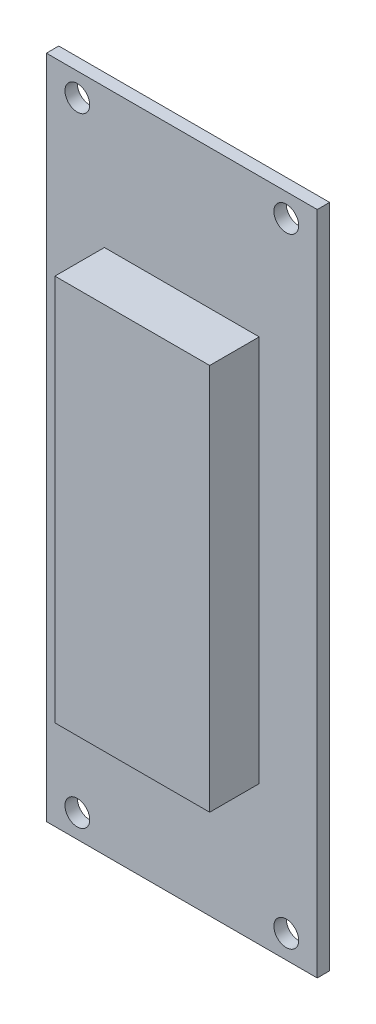
ISO-10303-21;
HEADER;
FILE_DESCRIPTION(('STEP AP214'),'2;1');
FILE_NAME('part.step','',(''),(''),'','','');
FILE_SCHEMA(('AUTOMOTIVE_DESIGN { 1 0 10303 214 1 1 1 1 }'));
ENDSEC;
DATA;
#1=APPLICATION_CONTEXT('core data for automotive mechanical design processes');
#2=APPLICATION_PROTOCOL_DEFINITION('international standard','automotive_design',2000,#1);
#3=PRODUCT_CONTEXT('',#1,'mechanical');
#4=PRODUCT('Part','Part','',(#3));
#5=PRODUCT_RELATED_PRODUCT_CATEGORY('part','',(#4));
#6=PRODUCT_DEFINITION_FORMATION('','',#4);
#7=PRODUCT_DEFINITION_CONTEXT('part definition',#1,'design');
#8=PRODUCT_DEFINITION('design','',#6,#7);
#9=PRODUCT_DEFINITION_SHAPE('','',#8);
#10=(LENGTH_UNIT() NAMED_UNIT(*) SI_UNIT(.MILLI.,.METRE.));
#11=(NAMED_UNIT(*) PLANE_ANGLE_UNIT() SI_UNIT($,.RADIAN.));
#12=(NAMED_UNIT(*) SI_UNIT($,.STERADIAN.) SOLID_ANGLE_UNIT());
#13=UNCERTAINTY_MEASURE_WITH_UNIT(LENGTH_MEASURE(1.E-05),#10,'distance_accuracy_value','');
#14=(GEOMETRIC_REPRESENTATION_CONTEXT(3) GLOBAL_UNCERTAINTY_ASSIGNED_CONTEXT((#13)) GLOBAL_UNIT_ASSIGNED_CONTEXT((#10,
#11,#12)) REPRESENTATION_CONTEXT('',''));
#15=CARTESIAN_POINT('',(0.,0.,0.));
#16=DIRECTION('',(0.,0.,1.));
#17=DIRECTION('',(1.,0.,0.));
#18=AXIS2_PLACEMENT_3D('',#15,#16,#17);
#19=CARTESIAN_POINT('',(-203.,-47.,550.));
#20=DIRECTION('',(0.,0.,1.));
#21=DIRECTION('',(1.,0.,0.));
#22=AXIS2_PLACEMENT_3D('',#19,#20,#21);
#23=PLANE('',#22);
#24=DIRECTION('',(0.,1.,0.));
#25=VECTOR('',#24,1.);
#26=CARTESIAN_POINT('',(-203.,-47.,550.));
#27=LINE('',#26,#25);
#28=CARTESIAN_POINT('',(-203.,-47.,550.));
#29=VERTEX_POINT('',#28);
#30=CARTESIAN_POINT('',(-203.,3.,550.));
#31=VERTEX_POINT('',#30);
#32=EDGE_CURVE('E165',#29,#31,#27,.T.);
#33=ORIENTED_EDGE('',*,*,#32,.F.);
#34=DIRECTION('',(1.,0.,0.));
#35=VECTOR('',#34,1.);
#36=CARTESIAN_POINT('',(-203.,-47.,550.));
#37=LINE('',#36,#35);
#38=CARTESIAN_POINT('',(-183.,-47.,550.));
#39=VERTEX_POINT('',#38);
#40=EDGE_CURVE('E218',#29,#39,#37,.T.);
#41=ORIENTED_EDGE('',*,*,#40,.T.);
#42=DIRECTION('',(0.,1.,0.));
#43=VECTOR('',#42,1.);
#44=CARTESIAN_POINT('',(-183.,-47.,550.));
#45=LINE('',#44,#43);
#46=CARTESIAN_POINT('',(-183.,3.,550.));
#47=VERTEX_POINT('',#46);
#48=EDGE_CURVE('E39',#39,#47,#45,.T.);
#49=ORIENTED_EDGE('',*,*,#48,.T.);
#50=DIRECTION('',(1.,0.,0.));
#51=VECTOR('',#50,1.);
#52=CARTESIAN_POINT('',(-203.,3.,550.));
#53=LINE('',#52,#51);
#54=EDGE_CURVE('E184',#31,#47,#53,.T.);
#55=ORIENTED_EDGE('',*,*,#54,.F.);
#56=EDGE_LOOP('',(#33,#41,#49,#55));
#57=FACE_BOUND('',#56,.T.);
#58=ADVANCED_FACE('F14',(#57),#23,.T.);
#59=CARTESIAN_POINT('',(-179.5,18.,537.));
#60=DIRECTION('',(0.,0.,1.));
#61=DIRECTION('',(1.,0.,0.));
#62=AXIS2_PLACEMENT_3D('',#59,#60,#61);
#63=CYLINDRICAL_SURFACE('',#62,1.6);
#64=DIRECTION('',(0.,0.,1.));
#65=VECTOR('',#64,1.);
#66=CARTESIAN_POINT('',(-177.9,18.,537.));
#67=LINE('',#66,#65);
#68=CARTESIAN_POINT('',(-177.9,18.,542.));
#69=VERTEX_POINT('',#68);
#70=CARTESIAN_POINT('',(-177.9,18.,543.6));
#71=VERTEX_POINT('',#70);
#72=EDGE_CURVE('E9',#69,#71,#67,.T.);
#73=ORIENTED_EDGE('',*,*,#72,.F.);
#74=CARTESIAN_POINT('',(-179.5,18.,542.));
#75=DIRECTION('',(0.,0.,1.));
#76=DIRECTION('',(1.,0.,0.));
#77=AXIS2_PLACEMENT_3D('',#74,#75,#76);
#78=CIRCLE('',#77,1.6);
#79=EDGE_CURVE('E158',#69,#69,#78,.T.);
#80=ORIENTED_EDGE('',*,*,#79,.F.);
#81=ORIENTED_EDGE('',*,*,#72,.T.);
#82=CARTESIAN_POINT('',(-179.5,18.,543.6));
#83=DIRECTION('',(0.,0.,1.));
#84=DIRECTION('',(1.,0.,0.));
#85=AXIS2_PLACEMENT_3D('',#82,#83,#84);
#86=CIRCLE('',#85,1.6);
#87=EDGE_CURVE('E190',#71,#71,#86,.T.);
#88=ORIENTED_EDGE('',*,*,#87,.T.);
#89=EDGE_LOOP('',(#73,#80,#81,#88));
#90=FACE_BOUND('',#89,.T.);
#91=ADVANCED_FACE('F312',(#90),#63,.F.);
#92=CARTESIAN_POINT('',(-206.5,18.,537.));
#93=DIRECTION('',(0.,0.,1.));
#94=DIRECTION('',(1.,0.,0.));
#95=AXIS2_PLACEMENT_3D('',#92,#93,#94);
#96=CYLINDRICAL_SURFACE('',#95,1.6);
#97=DIRECTION('',(0.,0.,1.));
#98=VECTOR('',#97,1.);
#99=CARTESIAN_POINT('',(-204.9,18.,537.));
#100=LINE('',#99,#98);
#101=CARTESIAN_POINT('',(-204.9,18.,542.));
#102=VERTEX_POINT('',#101);
#103=CARTESIAN_POINT('',(-204.9,18.,543.6));
#104=VERTEX_POINT('',#103);
#105=EDGE_CURVE('E25',#102,#104,#100,.T.);
#106=ORIENTED_EDGE('',*,*,#105,.F.);
#107=CARTESIAN_POINT('',(-206.5,18.,542.));
#108=DIRECTION('',(0.,0.,1.));
#109=DIRECTION('',(1.,0.,0.));
#110=AXIS2_PLACEMENT_3D('',#107,#108,#109);
#111=CIRCLE('',#110,1.6);
#112=EDGE_CURVE('E168',#102,#102,#111,.T.);
#113=ORIENTED_EDGE('',*,*,#112,.F.);
#114=ORIENTED_EDGE('',*,*,#105,.T.);
#115=CARTESIAN_POINT('',(-206.5,18.,543.6));
#116=DIRECTION('',(0.,0.,1.));
#117=DIRECTION('',(1.,0.,0.));
#118=AXIS2_PLACEMENT_3D('',#115,#116,#117);
#119=CIRCLE('',#118,1.6);
#120=EDGE_CURVE('E193',#104,#104,#119,.T.);
#121=ORIENTED_EDGE('',*,*,#120,.T.);
#122=EDGE_LOOP('',(#106,#113,#114,#121));
#123=FACE_BOUND('',#122,.T.);
#124=ADVANCED_FACE('F264',(#123),#96,.F.);
#125=CARTESIAN_POINT('',(-183.,-47.,543.6));
#126=DIRECTION('',(1.,0.,0.));
#127=DIRECTION('',(0.,1.,0.));
#128=AXIS2_PLACEMENT_3D('',#125,#126,#127);
#129=PLANE('',#128);
#130=DIRECTION('',(0.,0.,1.));
#131=VECTOR('',#130,1.);
#132=CARTESIAN_POINT('',(-183.,-47.,543.6));
#133=LINE('',#132,#131);
#134=CARTESIAN_POINT('',(-183.,-47.,543.6));
#135=VERTEX_POINT('',#134);
#136=EDGE_CURVE('E183',#135,#39,#133,.T.);
#137=ORIENTED_EDGE('',*,*,#136,.F.);
#138=DIRECTION('',(0.,1.,0.));
#139=VECTOR('',#138,1.);
#140=CARTESIAN_POINT('',(-183.,-47.,543.6));
#141=LINE('',#140,#139);
#142=CARTESIAN_POINT('',(-183.,3.,543.6));
#143=VERTEX_POINT('',#142);
#144=EDGE_CURVE('E240',#135,#143,#141,.T.);
#145=ORIENTED_EDGE('',*,*,#144,.T.);
#146=DIRECTION('',(0.,0.,1.));
#147=VECTOR('',#146,1.);
#148=CARTESIAN_POINT('',(-183.,3.,543.6));
#149=LINE('',#148,#147);
#150=EDGE_CURVE('E180',#143,#47,#149,.T.);
#151=ORIENTED_EDGE('',*,*,#150,.T.);
#152=ORIENTED_EDGE('',*,*,#48,.F.);
#153=EDGE_LOOP('',(#137,#145,#151,#152));
#154=FACE_BOUND('',#153,.T.);
#155=ADVANCED_FACE('F331',(#154),#129,.T.);
#156=CARTESIAN_POINT('',(-203.,-47.,543.6));
#157=DIRECTION('',(0.,1.,0.));
#158=DIRECTION('',(1.,0.,0.));
#159=AXIS2_PLACEMENT_3D('',#156,#157,#158);
#160=PLANE('',#159);
#161=ORIENTED_EDGE('',*,*,#136,.T.);
#162=ORIENTED_EDGE('',*,*,#40,.F.);
#163=DIRECTION('',(0.,0.,1.));
#164=VECTOR('',#163,1.);
#165=CARTESIAN_POINT('',(-203.,-47.,543.6));
#166=LINE('',#165,#164);
#167=CARTESIAN_POINT('',(-203.,-47.,543.6));
#168=VERTEX_POINT('',#167);
#169=EDGE_CURVE('E229',#168,#29,#166,.T.);
#170=ORIENTED_EDGE('',*,*,#169,.F.);
#171=DIRECTION('',(1.,0.,0.));
#172=VECTOR('',#171,1.);
#173=CARTESIAN_POINT('',(-203.,-47.,543.6));
#174=LINE('',#173,#172);
#175=EDGE_CURVE('E228',#168,#135,#174,.T.);
#176=ORIENTED_EDGE('',*,*,#175,.T.);
#177=EDGE_LOOP('',(#161,#162,#170,#176));
#178=FACE_BOUND('',#177,.T.);
#179=ADVANCED_FACE('F334',(#178),#160,.F.);
#180=CARTESIAN_POINT('',(-203.,3.,543.6));
#181=DIRECTION('',(0.,1.,0.));
#182=DIRECTION('',(1.,0.,0.));
#183=AXIS2_PLACEMENT_3D('',#180,#181,#182);
#184=PLANE('',#183);
#185=DIRECTION('',(1.,0.,0.));
#186=VECTOR('',#185,1.);
#187=CARTESIAN_POINT('',(-203.,3.,543.6));
#188=LINE('',#187,#186);
#189=CARTESIAN_POINT('',(-203.,3.,543.6));
#190=VERTEX_POINT('',#189);
#191=EDGE_CURVE('E244',#190,#143,#188,.T.);
#192=ORIENTED_EDGE('',*,*,#191,.F.);
#193=DIRECTION('',(0.,0.,1.));
#194=VECTOR('',#193,1.);
#195=CARTESIAN_POINT('',(-203.,3.,543.6));
#196=LINE('',#195,#194);
#197=EDGE_CURVE('E18',#190,#31,#196,.T.);
#198=ORIENTED_EDGE('',*,*,#197,.T.);
#199=ORIENTED_EDGE('',*,*,#54,.T.);
#200=ORIENTED_EDGE('',*,*,#150,.F.);
#201=EDGE_LOOP('',(#192,#198,#199,#200));
#202=FACE_BOUND('',#201,.T.);
#203=ADVANCED_FACE('F322',(#202),#184,.T.);
#204=CARTESIAN_POINT('',(-203.,-47.,543.6));
#205=DIRECTION('',(1.,0.,0.));
#206=DIRECTION('',(0.,1.,0.));
#207=AXIS2_PLACEMENT_3D('',#204,#205,#206);
#208=PLANE('',#207);
#209=ORIENTED_EDGE('',*,*,#32,.T.);
#210=ORIENTED_EDGE('',*,*,#197,.F.);
#211=DIRECTION('',(0.,1.,0.));
#212=VECTOR('',#211,1.);
#213=CARTESIAN_POINT('',(-203.,-47.,543.6));
#214=LINE('',#213,#212);
#215=EDGE_CURVE('E206',#168,#190,#214,.T.);
#216=ORIENTED_EDGE('',*,*,#215,.F.);
#217=ORIENTED_EDGE('',*,*,#169,.T.);
#218=EDGE_LOOP('',(#209,#210,#216,#217));
#219=FACE_BOUND('',#218,.T.);
#220=ADVANCED_FACE('F325',(#219),#208,.F.);
#221=CARTESIAN_POINT('',(-179.5,-62.,537.));
#222=DIRECTION('',(0.,0.,1.));
#223=DIRECTION('',(1.,0.,0.));
#224=AXIS2_PLACEMENT_3D('',#221,#222,#223);
#225=CYLINDRICAL_SURFACE('',#224,1.6);
#226=DIRECTION('',(0.,0.,1.));
#227=VECTOR('',#226,1.);
#228=CARTESIAN_POINT('',(-177.9,-62.,537.));
#229=LINE('',#228,#227);
#230=CARTESIAN_POINT('',(-177.9,-62.,542.));
#231=VERTEX_POINT('',#230);
#232=CARTESIAN_POINT('',(-177.9,-62.,543.6));
#233=VERTEX_POINT('',#232);
#234=EDGE_CURVE('E157',#231,#233,#229,.T.);
#235=ORIENTED_EDGE('',*,*,#234,.F.);
#236=CARTESIAN_POINT('',(-179.5,-62.,542.));
#237=DIRECTION('',(0.,0.,1.));
#238=DIRECTION('',(1.,0.,0.));
#239=AXIS2_PLACEMENT_3D('',#236,#237,#238);
#240=CIRCLE('',#239,1.6);
#241=EDGE_CURVE('E221',#231,#231,#240,.T.);
#242=ORIENTED_EDGE('',*,*,#241,.F.);
#243=ORIENTED_EDGE('',*,*,#234,.T.);
#244=CARTESIAN_POINT('',(-179.5,-62.,543.6));
#245=DIRECTION('',(0.,0.,1.));
#246=DIRECTION('',(1.,0.,0.));
#247=AXIS2_PLACEMENT_3D('',#244,#245,#246);
#248=CIRCLE('',#247,1.6);
#249=EDGE_CURVE('E200',#233,#233,#248,.T.);
#250=ORIENTED_EDGE('',*,*,#249,.T.);
#251=EDGE_LOOP('',(#235,#242,#243,#250));
#252=FACE_BOUND('',#251,.T.);
#253=ADVANCED_FACE('F16',(#252),#225,.F.);
#254=CARTESIAN_POINT('',(-206.5,-62.,537.));
#255=DIRECTION('',(0.,0.,1.));
#256=DIRECTION('',(1.,0.,0.));
#257=AXIS2_PLACEMENT_3D('',#254,#255,#256);
#258=CYLINDRICAL_SURFACE('',#257,1.6);
#259=DIRECTION('',(0.,0.,1.));
#260=VECTOR('',#259,1.);
#261=CARTESIAN_POINT('',(-204.9,-62.,537.));
#262=LINE('',#261,#260);
#263=CARTESIAN_POINT('',(-204.9,-62.,542.));
#264=VERTEX_POINT('',#263);
#265=CARTESIAN_POINT('',(-204.9,-62.,543.6));
#266=VERTEX_POINT('',#265);
#267=EDGE_CURVE('E150',#264,#266,#262,.T.);
#268=ORIENTED_EDGE('',*,*,#267,.F.);
#269=CARTESIAN_POINT('',(-206.5,-62.,542.));
#270=DIRECTION('',(0.,0.,1.));
#271=DIRECTION('',(1.,0.,0.));
#272=AXIS2_PLACEMENT_3D('',#269,#270,#271);
#273=CIRCLE('',#272,1.6);
#274=EDGE_CURVE('E155',#264,#264,#273,.T.);
#275=ORIENTED_EDGE('',*,*,#274,.F.);
#276=ORIENTED_EDGE('',*,*,#267,.T.);
#277=CARTESIAN_POINT('',(-206.5,-62.,543.6));
#278=DIRECTION('',(0.,0.,1.));
#279=DIRECTION('',(1.,0.,0.));
#280=AXIS2_PLACEMENT_3D('',#277,#278,#279);
#281=CIRCLE('',#280,1.6);
#282=EDGE_CURVE('E153',#266,#266,#281,.T.);
#283=ORIENTED_EDGE('',*,*,#282,.T.);
#284=EDGE_LOOP('',(#268,#275,#276,#283));
#285=FACE_BOUND('',#284,.T.);
#286=ADVANCED_FACE('F151',(#285),#258,.F.);
#287=CARTESIAN_POINT('',(-175.5,-65.,542.));
#288=DIRECTION('',(1.,0.,0.));
#289=DIRECTION('',(0.,1.,0.));
#290=AXIS2_PLACEMENT_3D('',#287,#288,#289);
#291=PLANE('',#290);
#292=DIRECTION('',(0.,0.,1.));
#293=VECTOR('',#292,1.);
#294=CARTESIAN_POINT('',(-175.5,-65.,542.));
#295=LINE('',#294,#293);
#296=CARTESIAN_POINT('',(-175.5,-65.,542.));
#297=VERTEX_POINT('',#296);
#298=CARTESIAN_POINT('',(-175.5,-65.,543.6));
#299=VERTEX_POINT('',#298);
#300=EDGE_CURVE('E215',#297,#299,#295,.T.);
#301=ORIENTED_EDGE('',*,*,#300,.F.);
#302=DIRECTION('',(0.,1.,0.));
#303=VECTOR('',#302,1.);
#304=CARTESIAN_POINT('',(-175.5,-65.,542.));
#305=LINE('',#304,#303);
#306=CARTESIAN_POINT('',(-175.5,21.,542.));
#307=VERTEX_POINT('',#306);
#308=EDGE_CURVE('E84',#297,#307,#305,.T.);
#309=ORIENTED_EDGE('',*,*,#308,.T.);
#310=DIRECTION('',(0.,0.,1.));
#311=VECTOR('',#310,1.);
#312=CARTESIAN_POINT('',(-175.5,21.,542.));
#313=LINE('',#312,#311);
#314=CARTESIAN_POINT('',(-175.5,21.,543.6));
#315=VERTEX_POINT('',#314);
#316=EDGE_CURVE('E176',#307,#315,#313,.T.);
#317=ORIENTED_EDGE('',*,*,#316,.T.);
#318=DIRECTION('',(0.,1.,0.));
#319=VECTOR('',#318,1.);
#320=CARTESIAN_POINT('',(-175.5,-65.,543.6));
#321=LINE('',#320,#319);
#322=EDGE_CURVE('E69',#299,#315,#321,.T.);
#323=ORIENTED_EDGE('',*,*,#322,.F.);
#324=EDGE_LOOP('',(#301,#309,#317,#323));
#325=FACE_BOUND('',#324,.T.);
#326=ADVANCED_FACE('F299',(#325),#291,.T.);
#327=CARTESIAN_POINT('',(-210.5,-65.,542.));
#328=DIRECTION('',(0.,0.,1.));
#329=DIRECTION('',(1.,0.,0.));
#330=AXIS2_PLACEMENT_3D('',#327,#328,#329);
#331=PLANE('',#330);
#332=ORIENTED_EDGE('',*,*,#79,.T.);
#333=EDGE_LOOP('',(#332));
#334=FACE_BOUND('',#333,.T.);
#335=ORIENTED_EDGE('',*,*,#112,.T.);
#336=EDGE_LOOP('',(#335));
#337=FACE_BOUND('',#336,.T.);
#338=ORIENTED_EDGE('',*,*,#241,.T.);
#339=EDGE_LOOP('',(#338));
#340=FACE_BOUND('',#339,.T.);
#341=ORIENTED_EDGE('',*,*,#274,.T.);
#342=EDGE_LOOP('',(#341));
#343=FACE_BOUND('',#342,.T.);
#344=DIRECTION('',(1.,0.,0.));
#345=VECTOR('',#344,1.);
#346=CARTESIAN_POINT('',(-210.5,21.,542.));
#347=LINE('',#346,#345);
#348=CARTESIAN_POINT('',(-210.5,21.,542.));
#349=VERTEX_POINT('',#348);
#350=EDGE_CURVE('E179',#349,#307,#347,.T.);
#351=ORIENTED_EDGE('',*,*,#350,.T.);
#352=ORIENTED_EDGE('',*,*,#308,.F.);
#353=DIRECTION('',(1.,0.,0.));
#354=VECTOR('',#353,1.);
#355=CARTESIAN_POINT('',(-210.5,-65.,542.));
#356=LINE('',#355,#354);
#357=CARTESIAN_POINT('',(-210.5,-65.,542.));
#358=VERTEX_POINT('',#357);
#359=EDGE_CURVE('E187',#358,#297,#356,.T.);
#360=ORIENTED_EDGE('',*,*,#359,.F.);
#361=DIRECTION('',(0.,1.,0.));
#362=VECTOR('',#361,1.);
#363=CARTESIAN_POINT('',(-210.5,-65.,542.));
#364=LINE('',#363,#362);
#365=EDGE_CURVE('E216',#358,#349,#364,.T.);
#366=ORIENTED_EDGE('',*,*,#365,.T.);
#367=EDGE_LOOP('',(#351,#352,#360,#366));
#368=FACE_BOUND('',#367,.T.);
#369=ADVANCED_FACE('F261',(#334,#337,#340,#343,#368),#331,.F.);
#370=CARTESIAN_POINT('',(-210.5,21.,542.));
#371=DIRECTION('',(0.,1.,0.));
#372=DIRECTION('',(1.,0.,0.));
#373=AXIS2_PLACEMENT_3D('',#370,#371,#372);
#374=PLANE('',#373);
#375=ORIENTED_EDGE('',*,*,#350,.F.);
#376=DIRECTION('',(0.,0.,1.));
#377=VECTOR('',#376,1.);
#378=CARTESIAN_POINT('',(-210.5,21.,542.));
#379=LINE('',#378,#377);
#380=CARTESIAN_POINT('',(-210.5,21.,543.6));
#381=VERTEX_POINT('',#380);
#382=EDGE_CURVE('E237',#349,#381,#379,.T.);
#383=ORIENTED_EDGE('',*,*,#382,.T.);
#384=DIRECTION('',(1.,0.,0.));
#385=VECTOR('',#384,1.);
#386=CARTESIAN_POINT('',(-210.5,21.,543.6));
#387=LINE('',#386,#385);
#388=EDGE_CURVE('E121',#381,#315,#387,.T.);
#389=ORIENTED_EDGE('',*,*,#388,.T.);
#390=ORIENTED_EDGE('',*,*,#316,.F.);
#391=EDGE_LOOP('',(#375,#383,#389,#390));
#392=FACE_BOUND('',#391,.T.);
#393=ADVANCED_FACE('F292',(#392),#374,.T.);
#394=CARTESIAN_POINT('',(-210.5,-65.,543.6));
#395=DIRECTION('',(0.,0.,1.));
#396=DIRECTION('',(1.,0.,0.));
#397=AXIS2_PLACEMENT_3D('',#394,#395,#396);
#398=PLANE('',#397);
#399=ORIENTED_EDGE('',*,*,#87,.F.);
#400=EDGE_LOOP('',(#399));
#401=FACE_BOUND('',#400,.T.);
#402=ORIENTED_EDGE('',*,*,#120,.F.);
#403=EDGE_LOOP('',(#402));
#404=FACE_BOUND('',#403,.T.);
#405=ORIENTED_EDGE('',*,*,#215,.T.);
#406=ORIENTED_EDGE('',*,*,#191,.T.);
#407=ORIENTED_EDGE('',*,*,#144,.F.);
#408=ORIENTED_EDGE('',*,*,#175,.F.);
#409=EDGE_LOOP('',(#405,#406,#407,#408));
#410=FACE_BOUND('',#409,.T.);
#411=ORIENTED_EDGE('',*,*,#249,.F.);
#412=EDGE_LOOP('',(#411));
#413=FACE_BOUND('',#412,.T.);
#414=ORIENTED_EDGE('',*,*,#282,.F.);
#415=EDGE_LOOP('',(#414));
#416=FACE_BOUND('',#415,.T.);
#417=DIRECTION('',(0.,1.,0.));
#418=VECTOR('',#417,1.);
#419=CARTESIAN_POINT('',(-210.5,-65.,543.6));
#420=LINE('',#419,#418);
#421=CARTESIAN_POINT('',(-210.5,-65.,543.6));
#422=VERTEX_POINT('',#421);
#423=EDGE_CURVE('E233',#422,#381,#420,.T.);
#424=ORIENTED_EDGE('',*,*,#423,.F.);
#425=DIRECTION('',(1.,0.,0.));
#426=VECTOR('',#425,1.);
#427=CARTESIAN_POINT('',(-210.5,-65.,543.6));
#428=LINE('',#427,#426);
#429=EDGE_CURVE('E113',#422,#299,#428,.T.);
#430=ORIENTED_EDGE('',*,*,#429,.T.);
#431=ORIENTED_EDGE('',*,*,#322,.T.);
#432=ORIENTED_EDGE('',*,*,#388,.F.);
#433=EDGE_LOOP('',(#424,#430,#431,#432));
#434=FACE_BOUND('',#433,.T.);
#435=ADVANCED_FACE('F296',(#401,#404,#410,#413,#416,#434),#398,.T.);
#436=CARTESIAN_POINT('',(-210.5,-65.,542.));
#437=DIRECTION('',(0.,1.,0.));
#438=DIRECTION('',(1.,0.,0.));
#439=AXIS2_PLACEMENT_3D('',#436,#437,#438);
#440=PLANE('',#439);
#441=ORIENTED_EDGE('',*,*,#300,.T.);
#442=ORIENTED_EDGE('',*,*,#429,.F.);
#443=DIRECTION('',(0.,0.,1.));
#444=VECTOR('',#443,1.);
#445=CARTESIAN_POINT('',(-210.5,-65.,542.));
#446=LINE('',#445,#444);
#447=EDGE_CURVE('E213',#358,#422,#446,.T.);
#448=ORIENTED_EDGE('',*,*,#447,.F.);
#449=ORIENTED_EDGE('',*,*,#359,.T.);
#450=EDGE_LOOP('',(#441,#442,#448,#449));
#451=FACE_BOUND('',#450,.T.);
#452=ADVANCED_FACE('F298',(#451),#440,.F.);
#453=CARTESIAN_POINT('',(-210.5,-65.,542.));
#454=DIRECTION('',(1.,0.,0.));
#455=DIRECTION('',(0.,1.,0.));
#456=AXIS2_PLACEMENT_3D('',#453,#454,#455);
#457=PLANE('',#456);
#458=ORIENTED_EDGE('',*,*,#423,.T.);
#459=ORIENTED_EDGE('',*,*,#382,.F.);
#460=ORIENTED_EDGE('',*,*,#365,.F.);
#461=ORIENTED_EDGE('',*,*,#447,.T.);
#462=EDGE_LOOP('',(#458,#459,#460,#461));
#463=FACE_BOUND('',#462,.T.);
#464=ADVANCED_FACE('F295',(#463),#457,.F.);
#465=CLOSED_SHELL('',(#58,#91,#124,#155,#179,#203,#220,#253,#286,#326,#369,#393,#435,#452,#464));
#466=MANIFOLD_SOLID_BREP('B1',#465);
#467=ADVANCED_BREP_SHAPE_REPRESENTATION('',(#18,#466),#14);
#468=SHAPE_DEFINITION_REPRESENTATION(#9,#467);
ENDSEC;
END-ISO-10303-21;
